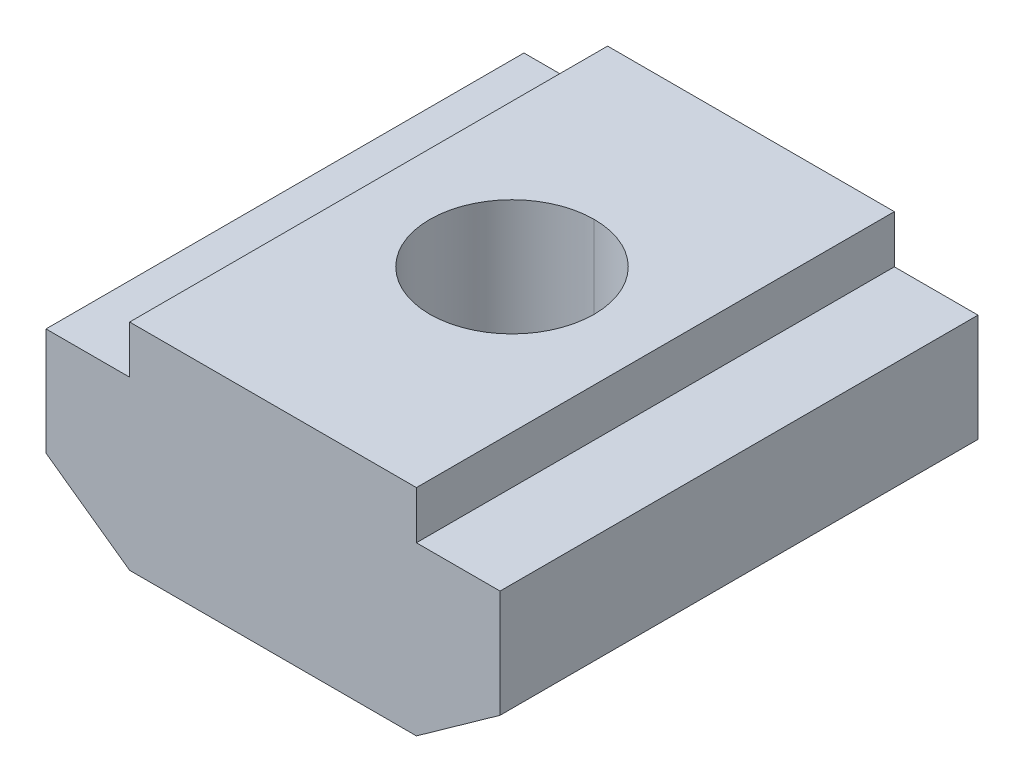
ISO-10303-21;
HEADER;
FILE_DESCRIPTION(('STEP AP214'),'2;1');
FILE_NAME('part.step','',(''),(''),'','','');
FILE_SCHEMA(('AUTOMOTIVE_DESIGN { 1 0 10303 214 1 1 1 1 }'));
ENDSEC;
DATA;
#1=APPLICATION_CONTEXT('core data for automotive mechanical design processes');
#2=APPLICATION_PROTOCOL_DEFINITION('international standard','automotive_design',2000,#1);
#3=PRODUCT_CONTEXT('',#1,'mechanical');
#4=PRODUCT('Part','Part','',(#3));
#5=PRODUCT_RELATED_PRODUCT_CATEGORY('part','',(#4));
#6=PRODUCT_DEFINITION_FORMATION('','',#4);
#7=PRODUCT_DEFINITION_CONTEXT('part definition',#1,'design');
#8=PRODUCT_DEFINITION('design','',#6,#7);
#9=PRODUCT_DEFINITION_SHAPE('','',#8);
#10=(LENGTH_UNIT() NAMED_UNIT(*) SI_UNIT(.MILLI.,.METRE.));
#11=(NAMED_UNIT(*) PLANE_ANGLE_UNIT() SI_UNIT($,.RADIAN.));
#12=(NAMED_UNIT(*) SI_UNIT($,.STERADIAN.) SOLID_ANGLE_UNIT());
#13=UNCERTAINTY_MEASURE_WITH_UNIT(LENGTH_MEASURE(1.E-05),#10,'distance_accuracy_value','');
#14=(GEOMETRIC_REPRESENTATION_CONTEXT(3) GLOBAL_UNCERTAINTY_ASSIGNED_CONTEXT((#13)) GLOBAL_UNIT_ASSIGNED_CONTEXT((#10,
#11,#12)) REPRESENTATION_CONTEXT('',''));
#15=CARTESIAN_POINT('',(0.,0.,0.));
#16=DIRECTION('',(0.,0.,1.));
#17=DIRECTION('',(1.,0.,0.));
#18=AXIS2_PLACEMENT_3D('',#15,#16,#17);
#19=CARTESIAN_POINT('',(0.,-4.501,5.));
#20=DIRECTION('',(0.,1.,0.));
#21=DIRECTION('',(0.,0.,1.));
#22=AXIS2_PLACEMENT_3D('',#19,#20,#21);
#23=CYLINDRICAL_SURFACE('',#22,1.72);
#24=DIRECTION('',(0.,1.,0.));
#25=VECTOR('',#24,1.);
#26=CARTESIAN_POINT('',(0.,-4.501,3.28));
#27=LINE('',#26,#25);
#28=CARTESIAN_POINT('',(0.,-4.5,3.28));
#29=VERTEX_POINT('',#28);
#30=CARTESIAN_POINT('',(0.,0.,3.28));
#31=VERTEX_POINT('',#30);
#32=EDGE_CURVE('E108',#29,#31,#27,.T.);
#33=ORIENTED_EDGE('',*,*,#32,.F.);
#34=CARTESIAN_POINT('',(0.,-4.5,5.));
#35=DIRECTION('',(0.,-1.,0.));
#36=DIRECTION('',(0.,0.,1.));
#37=AXIS2_PLACEMENT_3D('',#34,#35,#36);
#38=CIRCLE('',#37,1.72);
#39=CARTESIAN_POINT('',(0.,-4.5,6.72));
#40=VERTEX_POINT('',#39);
#41=EDGE_CURVE('E198',#29,#40,#38,.T.);
#42=ORIENTED_EDGE('',*,*,#41,.T.);
#43=DIRECTION('',(0.,1.,0.));
#44=VECTOR('',#43,1.);
#45=CARTESIAN_POINT('',(0.,-4.501,6.72));
#46=LINE('',#45,#44);
#47=CARTESIAN_POINT('',(0.,0.,6.72));
#48=VERTEX_POINT('',#47);
#49=EDGE_CURVE('E111',#40,#48,#46,.T.);
#50=ORIENTED_EDGE('',*,*,#49,.T.);
#51=CARTESIAN_POINT('',(0.,0.,5.));
#52=DIRECTION('',(0.,1.,0.));
#53=DIRECTION('',(0.,0.,1.));
#54=AXIS2_PLACEMENT_3D('',#51,#52,#53);
#55=CIRCLE('',#54,1.72);
#56=EDGE_CURVE('E100',#48,#31,#55,.T.);
#57=ORIENTED_EDGE('',*,*,#56,.T.);
#58=EDGE_LOOP('',(#33,#42,#50,#57));
#59=FACE_BOUND('',#58,.T.);
#60=ADVANCED_FACE('F16',(#59),#23,.F.);
#61=CARTESIAN_POINT('',(0.,0.,0.));
#62=DIRECTION('',(0.,0.,1.));
#63=DIRECTION('',(1.,0.,0.));
#64=AXIS2_PLACEMENT_3D('',#61,#62,#63);
#65=PLANE('',#64);
#66=DIRECTION('',(0.,1.,0.));
#67=VECTOR('',#66,1.);
#68=CARTESIAN_POINT('',(3.,0.,0.));
#69=LINE('',#68,#67);
#70=CARTESIAN_POINT('',(3.,-1.,0.));
#71=VERTEX_POINT('',#70);
#72=CARTESIAN_POINT('',(3.,0.,0.));
#73=VERTEX_POINT('',#72);
#74=EDGE_CURVE('E168',#71,#73,#69,.T.);
#75=ORIENTED_EDGE('',*,*,#74,.F.);
#76=DIRECTION('',(-1.,0.,0.));
#77=VECTOR('',#76,1.);
#78=CARTESIAN_POINT('',(3.,-1.,0.));
#79=LINE('',#78,#77);
#80=CARTESIAN_POINT('',(4.75,-1.,0.));
#81=VERTEX_POINT('',#80);
#82=EDGE_CURVE('E27',#81,#71,#79,.T.);
#83=ORIENTED_EDGE('',*,*,#82,.F.);
#84=DIRECTION('',(0.,1.,0.));
#85=VECTOR('',#84,1.);
#86=CARTESIAN_POINT('',(4.75,-1.,0.));
#87=LINE('',#86,#85);
#88=CARTESIAN_POINT('',(4.75,-3.25173713118024,0.));
#89=VERTEX_POINT('',#88);
#90=EDGE_CURVE('E154',#89,#81,#87,.T.);
#91=ORIENTED_EDGE('',*,*,#90,.F.);
#92=DIRECTION('',(0.814115518356318,0.580702955710941,0.));
#93=VECTOR('',#92,1.);
#94=CARTESIAN_POINT('',(4.75,-3.25173713118024,0.));
#95=LINE('',#94,#93);
#96=CARTESIAN_POINT('',(3.,-4.5,0.));
#97=VERTEX_POINT('',#96);
#98=EDGE_CURVE('E208',#97,#89,#95,.T.);
#99=ORIENTED_EDGE('',*,*,#98,.F.);
#100=DIRECTION('',(1.,0.,0.));
#101=VECTOR('',#100,1.);
#102=CARTESIAN_POINT('',(3.,-4.5,0.));
#103=LINE('',#102,#101);
#104=CARTESIAN_POINT('',(-3.,-4.5,0.));
#105=VERTEX_POINT('',#104);
#106=EDGE_CURVE('E200',#105,#97,#103,.T.);
#107=ORIENTED_EDGE('',*,*,#106,.F.);
#108=DIRECTION('',(0.814115518356318,-0.580702955710941,0.));
#109=VECTOR('',#108,1.);
#110=CARTESIAN_POINT('',(-4.75,-3.25173713118024,0.));
#111=LINE('',#110,#109);
#112=CARTESIAN_POINT('',(-4.75,-3.25173713118024,0.));
#113=VERTEX_POINT('',#112);
#114=EDGE_CURVE('E139',#113,#105,#111,.T.);
#115=ORIENTED_EDGE('',*,*,#114,.F.);
#116=DIRECTION('',(0.,-1.,0.));
#117=VECTOR('',#116,1.);
#118=CARTESIAN_POINT('',(-4.75,-1.,0.));
#119=LINE('',#118,#117);
#120=CARTESIAN_POINT('',(-4.75,-1.,0.));
#121=VERTEX_POINT('',#120);
#122=EDGE_CURVE('E145',#121,#113,#119,.T.);
#123=ORIENTED_EDGE('',*,*,#122,.F.);
#124=DIRECTION('',(-1.,0.,0.));
#125=VECTOR('',#124,1.);
#126=CARTESIAN_POINT('',(-3.,-1.,0.));
#127=LINE('',#126,#125);
#128=CARTESIAN_POINT('',(-3.,-1.,0.));
#129=VERTEX_POINT('',#128);
#130=EDGE_CURVE('E189',#129,#121,#127,.T.);
#131=ORIENTED_EDGE('',*,*,#130,.F.);
#132=DIRECTION('',(0.,-1.,0.));
#133=VECTOR('',#132,1.);
#134=CARTESIAN_POINT('',(-3.,0.,0.));
#135=LINE('',#134,#133);
#136=CARTESIAN_POINT('',(-3.,0.,0.));
#137=VERTEX_POINT('',#136);
#138=EDGE_CURVE('E114',#137,#129,#135,.T.);
#139=ORIENTED_EDGE('',*,*,#138,.F.);
#140=DIRECTION('',(-1.,0.,0.));
#141=VECTOR('',#140,1.);
#142=CARTESIAN_POINT('',(-3.,0.,0.));
#143=LINE('',#142,#141);
#144=EDGE_CURVE('E159',#73,#137,#143,.T.);
#145=ORIENTED_EDGE('',*,*,#144,.F.);
#146=EDGE_LOOP('',(#75,#83,#91,#99,#107,#115,#123,#131,#139,#145));
#147=FACE_BOUND('',#146,.T.);
#148=ADVANCED_FACE('F249',(#147),#65,.F.);
#149=CARTESIAN_POINT('',(0.,0.,10.));
#150=DIRECTION('',(0.,0.,1.));
#151=DIRECTION('',(1.,0.,0.));
#152=AXIS2_PLACEMENT_3D('',#149,#150,#151);
#153=PLANE('',#152);
#154=DIRECTION('',(0.,1.,0.));
#155=VECTOR('',#154,1.);
#156=CARTESIAN_POINT('',(3.,0.,10.));
#157=LINE('',#156,#155);
#158=CARTESIAN_POINT('',(3.,-1.,10.));
#159=VERTEX_POINT('',#158);
#160=CARTESIAN_POINT('',(3.,0.,10.));
#161=VERTEX_POINT('',#160);
#162=EDGE_CURVE('E184',#159,#161,#157,.T.);
#163=ORIENTED_EDGE('',*,*,#162,.T.);
#164=DIRECTION('',(-1.,0.,0.));
#165=VECTOR('',#164,1.);
#166=CARTESIAN_POINT('',(-3.,0.,10.));
#167=LINE('',#166,#165);
#168=CARTESIAN_POINT('',(-3.,0.,10.));
#169=VERTEX_POINT('',#168);
#170=EDGE_CURVE('E115',#161,#169,#167,.T.);
#171=ORIENTED_EDGE('',*,*,#170,.T.);
#172=DIRECTION('',(0.,-1.,0.));
#173=VECTOR('',#172,1.);
#174=CARTESIAN_POINT('',(-3.,0.,10.));
#175=LINE('',#174,#173);
#176=CARTESIAN_POINT('',(-3.,-1.,10.));
#177=VERTEX_POINT('',#176);
#178=EDGE_CURVE('E185',#169,#177,#175,.T.);
#179=ORIENTED_EDGE('',*,*,#178,.T.);
#180=DIRECTION('',(-1.,0.,0.));
#181=VECTOR('',#180,1.);
#182=CARTESIAN_POINT('',(-3.,-1.,10.));
#183=LINE('',#182,#181);
#184=CARTESIAN_POINT('',(-4.75,-1.,10.));
#185=VERTEX_POINT('',#184);
#186=EDGE_CURVE('E141',#177,#185,#183,.T.);
#187=ORIENTED_EDGE('',*,*,#186,.T.);
#188=DIRECTION('',(0.,-1.,0.));
#189=VECTOR('',#188,1.);
#190=CARTESIAN_POINT('',(-4.75,-1.,10.));
#191=LINE('',#190,#189);
#192=CARTESIAN_POINT('',(-4.75,-3.25173713118024,10.));
#193=VERTEX_POINT('',#192);
#194=EDGE_CURVE('E135',#185,#193,#191,.T.);
#195=ORIENTED_EDGE('',*,*,#194,.T.);
#196=DIRECTION('',(0.814115518356318,-0.580702955710941,0.));
#197=VECTOR('',#196,1.);
#198=CARTESIAN_POINT('',(-4.75,-3.25173713118024,10.));
#199=LINE('',#198,#197);
#200=CARTESIAN_POINT('',(-3.,-4.5,10.));
#201=VERTEX_POINT('',#200);
#202=EDGE_CURVE('E176',#193,#201,#199,.T.);
#203=ORIENTED_EDGE('',*,*,#202,.T.);
#204=DIRECTION('',(1.,0.,0.));
#205=VECTOR('',#204,1.);
#206=CARTESIAN_POINT('',(3.,-4.5,10.));
#207=LINE('',#206,#205);
#208=CARTESIAN_POINT('',(3.,-4.5,10.));
#209=VERTEX_POINT('',#208);
#210=EDGE_CURVE('E194',#201,#209,#207,.T.);
#211=ORIENTED_EDGE('',*,*,#210,.T.);
#212=DIRECTION('',(0.814115518356318,0.580702955710941,0.));
#213=VECTOR('',#212,1.);
#214=CARTESIAN_POINT('',(4.75,-3.25173713118024,10.));
#215=LINE('',#214,#213);
#216=CARTESIAN_POINT('',(4.75,-3.25173713118024,10.));
#217=VERTEX_POINT('',#216);
#218=EDGE_CURVE('E204',#209,#217,#215,.T.);
#219=ORIENTED_EDGE('',*,*,#218,.T.);
#220=DIRECTION('',(0.,1.,0.));
#221=VECTOR('',#220,1.);
#222=CARTESIAN_POINT('',(4.75,-1.,10.));
#223=LINE('',#222,#221);
#224=CARTESIAN_POINT('',(4.75,-1.,10.));
#225=VERTEX_POINT('',#224);
#226=EDGE_CURVE('E153',#217,#225,#223,.T.);
#227=ORIENTED_EDGE('',*,*,#226,.T.);
#228=DIRECTION('',(-1.,0.,0.));
#229=VECTOR('',#228,1.);
#230=CARTESIAN_POINT('',(3.,-1.,10.));
#231=LINE('',#230,#229);
#232=EDGE_CURVE('E10',#225,#159,#231,.T.);
#233=ORIENTED_EDGE('',*,*,#232,.T.);
#234=EDGE_LOOP('',(#163,#171,#179,#187,#195,#203,#211,#219,#227,#233));
#235=FACE_BOUND('',#234,.T.);
#236=ADVANCED_FACE('F486',(#235),#153,.T.);
#237=CARTESIAN_POINT('',(3.,-1.,10.));
#238=DIRECTION('',(0.,-1.,0.));
#239=DIRECTION('',(0.,0.,-1.));
#240=AXIS2_PLACEMENT_3D('',#237,#238,#239);
#241=PLANE('',#240);
#242=ORIENTED_EDGE('',*,*,#82,.T.);
#243=DIRECTION('',(0.,0.,-1.));
#244=VECTOR('',#243,1.);
#245=CARTESIAN_POINT('',(3.,-1.,10.));
#246=LINE('',#245,#244);
#247=EDGE_CURVE('E164',#159,#71,#246,.T.);
#248=ORIENTED_EDGE('',*,*,#247,.F.);
#249=ORIENTED_EDGE('',*,*,#232,.F.);
#250=DIRECTION('',(0.,0.,-1.));
#251=VECTOR('',#250,1.);
#252=CARTESIAN_POINT('',(4.75,-1.,10.));
#253=LINE('',#252,#251);
#254=EDGE_CURVE('E151',#225,#81,#253,.T.);
#255=ORIENTED_EDGE('',*,*,#254,.T.);
#256=EDGE_LOOP('',(#242,#248,#249,#255));
#257=FACE_BOUND('',#256,.T.);
#258=ADVANCED_FACE('F477',(#257),#241,.F.);
#259=CARTESIAN_POINT('',(4.75,-1.,10.));
#260=DIRECTION('',(-1.,0.,0.));
#261=DIRECTION('',(0.,0.,1.));
#262=AXIS2_PLACEMENT_3D('',#259,#260,#261);
#263=PLANE('',#262);
#264=ORIENTED_EDGE('',*,*,#90,.T.);
#265=ORIENTED_EDGE('',*,*,#254,.F.);
#266=ORIENTED_EDGE('',*,*,#226,.F.);
#267=DIRECTION('',(0.,0.,-1.));
#268=VECTOR('',#267,1.);
#269=CARTESIAN_POINT('',(4.75,-3.25173713118024,10.));
#270=LINE('',#269,#268);
#271=EDGE_CURVE('E20',#217,#89,#270,.T.);
#272=ORIENTED_EDGE('',*,*,#271,.T.);
#273=EDGE_LOOP('',(#264,#265,#266,#272));
#274=FACE_BOUND('',#273,.T.);
#275=ADVANCED_FACE('F468',(#274),#263,.F.);
#276=CARTESIAN_POINT('',(4.75,-3.25173713118024,10.));
#277=DIRECTION('',(-0.580702955710941,0.814115518356318,0.));
#278=DIRECTION('',(0.,0.,1.));
#279=AXIS2_PLACEMENT_3D('',#276,#277,#278);
#280=PLANE('',#279);
#281=ORIENTED_EDGE('',*,*,#98,.T.);
#282=ORIENTED_EDGE('',*,*,#271,.F.);
#283=ORIENTED_EDGE('',*,*,#218,.F.);
#284=DIRECTION('',(0.,0.,-1.));
#285=VECTOR('',#284,1.);
#286=CARTESIAN_POINT('',(3.,-4.5,10.));
#287=LINE('',#286,#285);
#288=EDGE_CURVE('E199',#209,#97,#287,.T.);
#289=ORIENTED_EDGE('',*,*,#288,.T.);
#290=EDGE_LOOP('',(#281,#282,#283,#289));
#291=FACE_BOUND('',#290,.T.);
#292=ADVANCED_FACE('F459',(#291),#280,.F.);
#293=CARTESIAN_POINT('',(3.,-4.5,10.));
#294=DIRECTION('',(0.,1.,0.));
#295=DIRECTION('',(1.,0.,0.));
#296=AXIS2_PLACEMENT_3D('',#293,#294,#295);
#297=PLANE('',#296);
#298=CARTESIAN_POINT('',(0.,-4.5,5.));
#299=DIRECTION('',(0.,-1.,0.));
#300=DIRECTION('',(0.,0.,1.));
#301=AXIS2_PLACEMENT_3D('',#298,#299,#300);
#302=CIRCLE('',#301,1.72);
#303=EDGE_CURVE('E125',#40,#29,#302,.T.);
#304=ORIENTED_EDGE('',*,*,#303,.F.);
#305=ORIENTED_EDGE('',*,*,#41,.F.);
#306=EDGE_LOOP('',(#304,#305));
#307=FACE_BOUND('',#306,.T.);
#308=ORIENTED_EDGE('',*,*,#106,.T.);
#309=ORIENTED_EDGE('',*,*,#288,.F.);
#310=ORIENTED_EDGE('',*,*,#210,.F.);
#311=DIRECTION('',(0.,0.,-1.));
#312=VECTOR('',#311,1.);
#313=CARTESIAN_POINT('',(-3.,-4.5,10.));
#314=LINE('',#313,#312);
#315=EDGE_CURVE('E150',#201,#105,#314,.T.);
#316=ORIENTED_EDGE('',*,*,#315,.T.);
#317=EDGE_LOOP('',(#308,#309,#310,#316));
#318=FACE_BOUND('',#317,.T.);
#319=ADVANCED_FACE('F453',(#307,#318),#297,.F.);
#320=CARTESIAN_POINT('',(-4.75,-3.25173713118024,10.));
#321=DIRECTION('',(0.580702955710941,0.814115518356318,0.));
#322=DIRECTION('',(0.,0.,-1.));
#323=AXIS2_PLACEMENT_3D('',#320,#321,#322);
#324=PLANE('',#323);
#325=ORIENTED_EDGE('',*,*,#114,.T.);
#326=ORIENTED_EDGE('',*,*,#315,.F.);
#327=ORIENTED_EDGE('',*,*,#202,.F.);
#328=DIRECTION('',(0.,0.,-1.));
#329=VECTOR('',#328,1.);
#330=CARTESIAN_POINT('',(-4.75,-3.25173713118024,10.));
#331=LINE('',#330,#329);
#332=EDGE_CURVE('E140',#193,#113,#331,.T.);
#333=ORIENTED_EDGE('',*,*,#332,.T.);
#334=EDGE_LOOP('',(#325,#326,#327,#333));
#335=FACE_BOUND('',#334,.T.);
#336=ADVANCED_FACE('F18',(#335),#324,.F.);
#337=CARTESIAN_POINT('',(-4.75,-1.,10.));
#338=DIRECTION('',(1.,0.,0.));
#339=DIRECTION('',(0.,1.,0.));
#340=AXIS2_PLACEMENT_3D('',#337,#338,#339);
#341=PLANE('',#340);
#342=ORIENTED_EDGE('',*,*,#122,.T.);
#343=ORIENTED_EDGE('',*,*,#332,.F.);
#344=ORIENTED_EDGE('',*,*,#194,.F.);
#345=DIRECTION('',(0.,0.,-1.));
#346=VECTOR('',#345,1.);
#347=CARTESIAN_POINT('',(-4.75,-1.,10.));
#348=LINE('',#347,#346);
#349=EDGE_CURVE('E146',#185,#121,#348,.T.);
#350=ORIENTED_EDGE('',*,*,#349,.T.);
#351=EDGE_LOOP('',(#342,#343,#344,#350));
#352=FACE_BOUND('',#351,.T.);
#353=ADVANCED_FACE('F244',(#352),#341,.F.);
#354=CARTESIAN_POINT('',(-3.,-1.,10.));
#355=DIRECTION('',(0.,-1.,0.));
#356=DIRECTION('',(0.,0.,-1.));
#357=AXIS2_PLACEMENT_3D('',#354,#355,#356);
#358=PLANE('',#357);
#359=ORIENTED_EDGE('',*,*,#130,.T.);
#360=ORIENTED_EDGE('',*,*,#349,.F.);
#361=ORIENTED_EDGE('',*,*,#186,.F.);
#362=DIRECTION('',(0.,0.,-1.));
#363=VECTOR('',#362,1.);
#364=CARTESIAN_POINT('',(-3.,-1.,10.));
#365=LINE('',#364,#363);
#366=EDGE_CURVE('E190',#177,#129,#365,.T.);
#367=ORIENTED_EDGE('',*,*,#366,.T.);
#368=EDGE_LOOP('',(#359,#360,#361,#367));
#369=FACE_BOUND('',#368,.T.);
#370=ADVANCED_FACE('F430',(#369),#358,.F.);
#371=CARTESIAN_POINT('',(-3.,0.,10.));
#372=DIRECTION('',(1.,0.,0.));
#373=DIRECTION('',(0.,1.,0.));
#374=AXIS2_PLACEMENT_3D('',#371,#372,#373);
#375=PLANE('',#374);
#376=ORIENTED_EDGE('',*,*,#138,.T.);
#377=ORIENTED_EDGE('',*,*,#366,.F.);
#378=ORIENTED_EDGE('',*,*,#178,.F.);
#379=DIRECTION('',(0.,0.,-1.));
#380=VECTOR('',#379,1.);
#381=CARTESIAN_POINT('',(-3.,0.,10.));
#382=LINE('',#381,#380);
#383=EDGE_CURVE('E163',#169,#137,#382,.T.);
#384=ORIENTED_EDGE('',*,*,#383,.T.);
#385=EDGE_LOOP('',(#376,#377,#378,#384));
#386=FACE_BOUND('',#385,.T.);
#387=ADVANCED_FACE('F424',(#386),#375,.F.);
#388=CARTESIAN_POINT('',(-3.,0.,10.));
#389=DIRECTION('',(0.,-1.,0.));
#390=DIRECTION('',(0.,0.,-1.));
#391=AXIS2_PLACEMENT_3D('',#388,#389,#390);
#392=PLANE('',#391);
#393=ORIENTED_EDGE('',*,*,#56,.F.);
#394=CARTESIAN_POINT('',(0.,0.,5.));
#395=DIRECTION('',(0.,1.,0.));
#396=DIRECTION('',(0.,0.,1.));
#397=AXIS2_PLACEMENT_3D('',#394,#395,#396);
#398=CIRCLE('',#397,1.72);
#399=EDGE_CURVE('E117',#31,#48,#398,.T.);
#400=ORIENTED_EDGE('',*,*,#399,.F.);
#401=EDGE_LOOP('',(#393,#400));
#402=FACE_BOUND('',#401,.T.);
#403=ORIENTED_EDGE('',*,*,#144,.T.);
#404=ORIENTED_EDGE('',*,*,#383,.F.);
#405=ORIENTED_EDGE('',*,*,#170,.F.);
#406=DIRECTION('',(0.,0.,-1.));
#407=VECTOR('',#406,1.);
#408=CARTESIAN_POINT('',(3.,0.,10.));
#409=LINE('',#408,#407);
#410=EDGE_CURVE('E172',#161,#73,#409,.T.);
#411=ORIENTED_EDGE('',*,*,#410,.T.);
#412=EDGE_LOOP('',(#403,#404,#405,#411));
#413=FACE_BOUND('',#412,.T.);
#414=ADVANCED_FACE('F118',(#402,#413),#392,.F.);
#415=CARTESIAN_POINT('',(3.,0.,10.));
#416=DIRECTION('',(-1.,0.,0.));
#417=DIRECTION('',(0.,0.,1.));
#418=AXIS2_PLACEMENT_3D('',#415,#416,#417);
#419=PLANE('',#418);
#420=ORIENTED_EDGE('',*,*,#74,.T.);
#421=ORIENTED_EDGE('',*,*,#410,.F.);
#422=ORIENTED_EDGE('',*,*,#162,.F.);
#423=ORIENTED_EDGE('',*,*,#247,.T.);
#424=EDGE_LOOP('',(#420,#421,#422,#423));
#425=FACE_BOUND('',#424,.T.);
#426=ADVANCED_FACE('F404',(#425),#419,.F.);
#427=CARTESIAN_POINT('',(0.,-4.501,5.));
#428=DIRECTION('',(0.,1.,0.));
#429=DIRECTION('',(0.,0.,1.));
#430=AXIS2_PLACEMENT_3D('',#427,#428,#429);
#431=CYLINDRICAL_SURFACE('',#430,1.72);
#432=ORIENTED_EDGE('',*,*,#303,.T.);
#433=ORIENTED_EDGE('',*,*,#32,.T.);
#434=ORIENTED_EDGE('',*,*,#399,.T.);
#435=ORIENTED_EDGE('',*,*,#49,.F.);
#436=EDGE_LOOP('',(#432,#433,#434,#435));
#437=FACE_BOUND('',#436,.T.);
#438=ADVANCED_FACE('F123',(#437),#431,.F.);
#439=CLOSED_SHELL('',(#60,#148,#236,#258,#275,#292,#319,#336,#353,#370,#387,#414,#426,#438));
#440=MANIFOLD_SOLID_BREP('B1',#439);
#441=ADVANCED_BREP_SHAPE_REPRESENTATION('',(#18,#440),#14);
#442=SHAPE_DEFINITION_REPRESENTATION(#9,#441);
ENDSEC;
END-ISO-10303-21;
